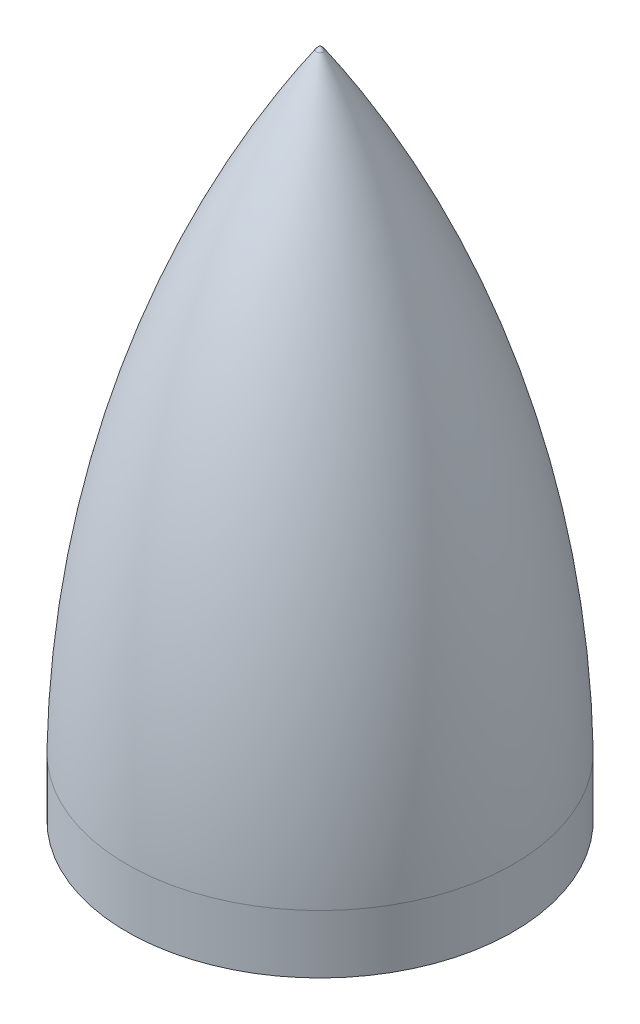
ISO-10303-21;
HEADER;
FILE_DESCRIPTION(('STEP AP214'),'2;1');
FILE_NAME('part.step','',(''),(''),'','','');
FILE_SCHEMA(('AUTOMOTIVE_DESIGN { 1 0 10303 214 1 1 1 1 }'));
ENDSEC;
DATA;
#1=APPLICATION_CONTEXT('core data for automotive mechanical design processes');
#2=APPLICATION_PROTOCOL_DEFINITION('international standard','automotive_design',2000,#1);
#3=PRODUCT_CONTEXT('',#1,'mechanical');
#4=PRODUCT('Part','Part','',(#3));
#5=PRODUCT_RELATED_PRODUCT_CATEGORY('part','',(#4));
#6=PRODUCT_DEFINITION_FORMATION('','',#4);
#7=PRODUCT_DEFINITION_CONTEXT('part definition',#1,'design');
#8=PRODUCT_DEFINITION('design','',#6,#7);
#9=PRODUCT_DEFINITION_SHAPE('','',#8);
#10=(LENGTH_UNIT() NAMED_UNIT(*) SI_UNIT(.MILLI.,.METRE.));
#11=(NAMED_UNIT(*) PLANE_ANGLE_UNIT() SI_UNIT($,.RADIAN.));
#12=(NAMED_UNIT(*) SI_UNIT($,.STERADIAN.) SOLID_ANGLE_UNIT());
#13=UNCERTAINTY_MEASURE_WITH_UNIT(LENGTH_MEASURE(1.E-05),#10,'distance_accuracy_value','');
#14=(GEOMETRIC_REPRESENTATION_CONTEXT(3) GLOBAL_UNCERTAINTY_ASSIGNED_CONTEXT((#13)) GLOBAL_UNIT_ASSIGNED_CONTEXT((#10,
#11,#12)) REPRESENTATION_CONTEXT('',''));
#15=CARTESIAN_POINT('',(0.,0.,0.));
#16=DIRECTION('',(0.,0.,1.));
#17=DIRECTION('',(1.,0.,0.));
#18=AXIS2_PLACEMENT_3D('',#15,#16,#17);
#19=CARTESIAN_POINT('',(0.,4.,0.));
#20=DIRECTION('',(0.,1.,0.));
#21=DIRECTION('',(0.,0.,1.));
#22=AXIS2_PLACEMENT_3D('',#19,#20,#21);
#23=PLANE('',#22);
#24=CARTESIAN_POINT('',(0.,4.,0.));
#25=DIRECTION('',(0.,1.,0.));
#26=DIRECTION('',(0.,0.,1.));
#27=AXIS2_PLACEMENT_3D('',#24,#25,#26);
#28=CIRCLE('',#27,6.00000000000002);
#29=CARTESIAN_POINT('',(0.,4.,6.00000000000002));
#30=VERTEX_POINT('',#29);
#31=EDGE_CURVE('E505',#30,#30,#28,.T.);
#32=ORIENTED_EDGE('',*,*,#31,.F.);
#33=EDGE_LOOP('',(#32));
#34=FACE_BOUND('',#33,.T.);
#35=DIRECTION('',(0.,0.,1.));
#36=VECTOR('',#35,1.);
#37=CARTESIAN_POINT('',(5.00000000000001,4.,0.));
#38=LINE('',#37,#36);
#39=CARTESIAN_POINT('',(5.,4.,6.99999999999998));
#40=VERTEX_POINT('',#39);
#41=CARTESIAN_POINT('',(5.,4.,42.6431706138275));
#42=VERTEX_POINT('',#41);
#43=EDGE_CURVE('E494',#40,#42,#38,.T.);
#44=ORIENTED_EDGE('',*,*,#43,.F.);
#45=CARTESIAN_POINT('',(7.,4.,6.99999999999998));
#46=DIRECTION('',(0.,1.,0.));
#47=DIRECTION('',(0.,0.,1.));
#48=AXIS2_PLACEMENT_3D('',#45,#46,#47);
#49=CIRCLE('',#48,2.);
#50=CARTESIAN_POINT('',(7.00000000000001,4.,4.99999999999998));
#51=VERTEX_POINT('',#50);
#52=EDGE_CURVE('E396',#40,#51,#49,.F.);
#53=ORIENTED_EDGE('',*,*,#52,.T.);
#54=DIRECTION('',(1.,0.,0.));
#55=VECTOR('',#54,1.);
#56=CARTESIAN_POINT('',(0.,4.,4.99999999999998));
#57=LINE('',#56,#55);
#58=CARTESIAN_POINT('',(42.6431706138275,4.,5.));
#59=VERTEX_POINT('',#58);
#60=EDGE_CURVE('E497',#51,#59,#57,.T.);
#61=ORIENTED_EDGE('',*,*,#60,.T.);
#62=CARTESIAN_POINT('',(42.6431706138275,4.,10.));
#63=DIRECTION('',(0.,1.,0.));
#64=DIRECTION('',(0.,0.,1.));
#65=AXIS2_PLACEMENT_3D('',#62,#63,#64);
#66=CIRCLE('',#65,5.);
#67=CARTESIAN_POINT('',(47.511112464721,4.,11.1415525114155));
#68=VERTEX_POINT('',#67);
#69=EDGE_CURVE('E328',#59,#68,#66,.F.);
#70=ORIENTED_EDGE('',*,*,#69,.T.);
#71=CARTESIAN_POINT('',(0.,4.,0.));
#72=DIRECTION('',(0.,-1.,0.));
#73=DIRECTION('',(0.,0.,-1.));
#74=AXIS2_PLACEMENT_3D('',#71,#72,#73);
#75=CIRCLE('',#74,48.8);
#76=CARTESIAN_POINT('',(47.511112464721,4.,-11.1415525114155));
#77=VERTEX_POINT('',#76);
#78=EDGE_CURVE('E239',#77,#68,#75,.T.);
#79=ORIENTED_EDGE('',*,*,#78,.F.);
#80=CARTESIAN_POINT('',(42.6431706138275,4.,-10.));
#81=DIRECTION('',(0.,1.,0.));
#82=DIRECTION('',(0.,0.,1.));
#83=AXIS2_PLACEMENT_3D('',#80,#81,#82);
#84=CIRCLE('',#83,5.);
#85=CARTESIAN_POINT('',(42.6431706138275,4.,-5.));
#86=VERTEX_POINT('',#85);
#87=EDGE_CURVE('E321',#77,#86,#84,.F.);
#88=ORIENTED_EDGE('',*,*,#87,.T.);
#89=DIRECTION('',(1.,0.,0.));
#90=VECTOR('',#89,1.);
#91=CARTESIAN_POINT('',(0.,4.,-5.00000000000002));
#92=LINE('',#91,#90);
#93=CARTESIAN_POINT('',(7.,4.,-5.00000000000002));
#94=VERTEX_POINT('',#93);
#95=EDGE_CURVE('E488',#94,#86,#92,.T.);
#96=ORIENTED_EDGE('',*,*,#95,.F.);
#97=CARTESIAN_POINT('',(7.,4.,-7.00000000000002));
#98=DIRECTION('',(0.,1.,0.));
#99=DIRECTION('',(0.,0.,1.));
#100=AXIS2_PLACEMENT_3D('',#97,#98,#99);
#101=CIRCLE('',#100,2.);
#102=CARTESIAN_POINT('',(5.,4.,-7.00000000000002));
#103=VERTEX_POINT('',#102);
#104=EDGE_CURVE('E390',#94,#103,#101,.F.);
#105=ORIENTED_EDGE('',*,*,#104,.T.);
#106=DIRECTION('',(0.,0.,-1.));
#107=VECTOR('',#106,1.);
#108=CARTESIAN_POINT('',(4.99999999999999,4.,0.));
#109=LINE('',#108,#107);
#110=CARTESIAN_POINT('',(5.00000000000001,4.,-42.6431706138275));
#111=VERTEX_POINT('',#110);
#112=EDGE_CURVE('E491',#103,#111,#109,.T.);
#113=ORIENTED_EDGE('',*,*,#112,.T.);
#114=CARTESIAN_POINT('',(10.,4.,-42.6431706138275));
#115=DIRECTION('',(0.,1.,0.));
#116=DIRECTION('',(0.,0.,1.));
#117=AXIS2_PLACEMENT_3D('',#114,#115,#116);
#118=CIRCLE('',#117,5.);
#119=CARTESIAN_POINT('',(11.1415525114155,4.,-47.511112464721));
#120=VERTEX_POINT('',#119);
#121=EDGE_CURVE('E342',#111,#120,#118,.F.);
#122=ORIENTED_EDGE('',*,*,#121,.T.);
#123=CARTESIAN_POINT('',(-11.1415525114155,4.,-47.511112464721));
#124=VERTEX_POINT('',#123);
#125=EDGE_CURVE('E235',#124,#120,#75,.T.);
#126=ORIENTED_EDGE('',*,*,#125,.F.);
#127=CARTESIAN_POINT('',(-9.99999999999999,4.,-42.6431706138275));
#128=DIRECTION('',(0.,1.,0.));
#129=DIRECTION('',(0.,0.,1.));
#130=AXIS2_PLACEMENT_3D('',#127,#128,#129);
#131=CIRCLE('',#130,5.);
#132=CARTESIAN_POINT('',(-4.99999999999999,4.,-42.6431706138275));
#133=VERTEX_POINT('',#132);
#134=EDGE_CURVE('E335',#124,#133,#131,.F.);
#135=ORIENTED_EDGE('',*,*,#134,.T.);
#136=DIRECTION('',(0.,0.,-1.));
#137=VECTOR('',#136,1.);
#138=CARTESIAN_POINT('',(-5.00000000000001,4.,0.));
#139=LINE('',#138,#137);
#140=CARTESIAN_POINT('',(-5.,4.,-6.99999999999998));
#141=VERTEX_POINT('',#140);
#142=EDGE_CURVE('E483',#141,#133,#139,.T.);
#143=ORIENTED_EDGE('',*,*,#142,.F.);
#144=CARTESIAN_POINT('',(-7.,4.,-6.99999999999998));
#145=DIRECTION('',(0.,1.,0.));
#146=DIRECTION('',(0.,0.,1.));
#147=AXIS2_PLACEMENT_3D('',#144,#145,#146);
#148=CIRCLE('',#147,2.);
#149=CARTESIAN_POINT('',(-7.00000000000001,4.,-4.99999999999998));
#150=VERTEX_POINT('',#149);
#151=EDGE_CURVE('E402',#141,#150,#148,.F.);
#152=ORIENTED_EDGE('',*,*,#151,.T.);
#153=DIRECTION('',(-1.,0.,0.));
#154=VECTOR('',#153,1.);
#155=CARTESIAN_POINT('',(0.,4.,-4.99999999999998));
#156=LINE('',#155,#154);
#157=CARTESIAN_POINT('',(-42.6431706138275,4.,-5.));
#158=VERTEX_POINT('',#157);
#159=EDGE_CURVE('E423',#150,#158,#156,.T.);
#160=ORIENTED_EDGE('',*,*,#159,.T.);
#161=CARTESIAN_POINT('',(-42.6431706138275,4.,-9.99999999999999));
#162=DIRECTION('',(0.,1.,0.));
#163=DIRECTION('',(0.,0.,1.));
#164=AXIS2_PLACEMENT_3D('',#161,#162,#163);
#165=CIRCLE('',#164,5.);
#166=CARTESIAN_POINT('',(-47.511112464721,4.,-11.1415525114155));
#167=VERTEX_POINT('',#166);
#168=EDGE_CURVE('E349',#158,#167,#165,.F.);
#169=ORIENTED_EDGE('',*,*,#168,.T.);
#170=CARTESIAN_POINT('',(-47.511112464721,4.,11.1415525114155));
#171=VERTEX_POINT('',#170);
#172=EDGE_CURVE('E238',#171,#167,#75,.T.);
#173=ORIENTED_EDGE('',*,*,#172,.F.);
#174=CARTESIAN_POINT('',(-42.6431706138275,4.,10.));
#175=DIRECTION('',(0.,1.,0.));
#176=DIRECTION('',(0.,0.,1.));
#177=AXIS2_PLACEMENT_3D('',#174,#175,#176);
#178=CIRCLE('',#177,5.);
#179=CARTESIAN_POINT('',(-42.6431706138275,4.,5.00000000000001));
#180=VERTEX_POINT('',#179);
#181=EDGE_CURVE('E356',#171,#180,#178,.F.);
#182=ORIENTED_EDGE('',*,*,#181,.T.);
#183=DIRECTION('',(-1.,0.,0.));
#184=VECTOR('',#183,1.);
#185=CARTESIAN_POINT('',(0.,4.,5.00000000000002));
#186=LINE('',#185,#184);
#187=CARTESIAN_POINT('',(-6.99999999999999,4.,5.00000000000002));
#188=VERTEX_POINT('',#187);
#189=EDGE_CURVE('E477',#188,#180,#186,.T.);
#190=ORIENTED_EDGE('',*,*,#189,.F.);
#191=CARTESIAN_POINT('',(-6.99999999999999,4.,7.00000000000002));
#192=DIRECTION('',(0.,1.,0.));
#193=DIRECTION('',(0.,0.,1.));
#194=AXIS2_PLACEMENT_3D('',#191,#192,#193);
#195=CIRCLE('',#194,2.);
#196=CARTESIAN_POINT('',(-4.99999999999999,4.,7.00000000000002));
#197=VERTEX_POINT('',#196);
#198=EDGE_CURVE('E11',#188,#197,#195,.F.);
#199=ORIENTED_EDGE('',*,*,#198,.T.);
#200=DIRECTION('',(0.,0.,1.));
#201=VECTOR('',#200,1.);
#202=CARTESIAN_POINT('',(-4.99999999999999,4.,0.));
#203=LINE('',#202,#201);
#204=CARTESIAN_POINT('',(-5.,4.,42.6431706138275));
#205=VERTEX_POINT('',#204);
#206=EDGE_CURVE('E480',#197,#205,#203,.T.);
#207=ORIENTED_EDGE('',*,*,#206,.T.);
#208=CARTESIAN_POINT('',(-10.,4.,42.6431706138275));
#209=DIRECTION('',(0.,1.,0.));
#210=DIRECTION('',(0.,0.,1.));
#211=AXIS2_PLACEMENT_3D('',#208,#209,#210);
#212=CIRCLE('',#211,5.);
#213=CARTESIAN_POINT('',(-11.1415525114155,4.,47.511112464721));
#214=VERTEX_POINT('',#213);
#215=EDGE_CURVE('E314',#205,#214,#212,.F.);
#216=ORIENTED_EDGE('',*,*,#215,.T.);
#217=CARTESIAN_POINT('',(11.1415525114155,4.,47.511112464721));
#218=VERTEX_POINT('',#217);
#219=EDGE_CURVE('E407',#218,#214,#75,.T.);
#220=ORIENTED_EDGE('',*,*,#219,.F.);
#221=CARTESIAN_POINT('',(10.,4.,42.6431706138275));
#222=DIRECTION('',(0.,1.,0.));
#223=DIRECTION('',(0.,0.,1.));
#224=AXIS2_PLACEMENT_3D('',#221,#222,#223);
#225=CIRCLE('',#224,5.);
#226=EDGE_CURVE('E307',#218,#42,#225,.F.);
#227=ORIENTED_EDGE('',*,*,#226,.T.);
#228=EDGE_LOOP('',(#44,#53,#61,#70,#79,#88,#96,#105,#113,#122,#126,#135,#143,#152,#160,#169,
#173,#182,#190,#199,#207,#216,#220,#227));
#229=FACE_BOUND('',#228,.T.);
#230=ADVANCED_FACE('F43',(#34,#229),#23,.T.);
#231=CARTESIAN_POINT('',(0.,0.,0.));
#232=DIRECTION('',(0.,-1.,0.));
#233=DIRECTION('',(0.,0.,-1.));
#234=AXIS2_PLACEMENT_3D('',#231,#232,#233);
#235=CYLINDRICAL_SURFACE('',#234,48.8);
#236=CARTESIAN_POINT('',(0.,0.,0.));
#237=DIRECTION('',(0.,-1.,0.));
#238=DIRECTION('',(0.,0.,-1.));
#239=AXIS2_PLACEMENT_3D('',#236,#237,#238);
#240=CIRCLE('',#239,48.8);
#241=CARTESIAN_POINT('',(47.511112464721,0.,11.1415525114155));
#242=VERTEX_POINT('',#241);
#243=CARTESIAN_POINT('',(11.1415525114155,0.,47.511112464721));
#244=VERTEX_POINT('',#243);
#245=EDGE_CURVE('E463',#242,#244,#240,.T.);
#246=ORIENTED_EDGE('',*,*,#245,.T.);
#247=DIRECTION('',(0.,-1.,0.));
#248=VECTOR('',#247,1.);
#249=CARTESIAN_POINT('',(11.1415525114155,0.,47.511112464721));
#250=LINE('',#249,#248);
#251=EDGE_CURVE('E272',#244,#218,#250,.F.);
#252=ORIENTED_EDGE('',*,*,#251,.T.);
#253=ORIENTED_EDGE('',*,*,#219,.T.);
#254=DIRECTION('',(0.,-1.,0.));
#255=VECTOR('',#254,1.);
#256=CARTESIAN_POINT('',(-11.1415525114155,0.,47.511112464721));
#257=LINE('',#256,#255);
#258=CARTESIAN_POINT('',(-11.1415525114155,0.,47.511112464721));
#259=VERTEX_POINT('',#258);
#260=EDGE_CURVE('E268',#214,#259,#257,.T.);
#261=ORIENTED_EDGE('',*,*,#260,.T.);
#262=CARTESIAN_POINT('',(0.,0.,0.));
#263=DIRECTION('',(0.,-1.,0.));
#264=DIRECTION('',(0.,0.,-1.));
#265=AXIS2_PLACEMENT_3D('',#262,#263,#264);
#266=CIRCLE('',#265,48.8);
#267=CARTESIAN_POINT('',(-47.511112464721,0.,11.1415525114155));
#268=VERTEX_POINT('',#267);
#269=EDGE_CURVE('E471',#259,#268,#266,.T.);
#270=ORIENTED_EDGE('',*,*,#269,.T.);
#271=DIRECTION('',(0.,-1.,0.));
#272=VECTOR('',#271,1.);
#273=CARTESIAN_POINT('',(-47.511112464721,0.,11.1415525114155));
#274=LINE('',#273,#272);
#275=EDGE_CURVE('E244',#268,#171,#274,.F.);
#276=ORIENTED_EDGE('',*,*,#275,.T.);
#277=ORIENTED_EDGE('',*,*,#172,.T.);
#278=DIRECTION('',(0.,-1.,0.));
#279=VECTOR('',#278,1.);
#280=CARTESIAN_POINT('',(-47.511112464721,0.,-11.1415525114155));
#281=LINE('',#280,#279);
#282=CARTESIAN_POINT('',(-47.511112464721,0.,-11.1415525114155));
#283=VERTEX_POINT('',#282);
#284=EDGE_CURVE('E248',#167,#283,#281,.T.);
#285=ORIENTED_EDGE('',*,*,#284,.T.);
#286=CARTESIAN_POINT('',(0.,0.,0.));
#287=DIRECTION('',(0.,-1.,0.));
#288=DIRECTION('',(0.,0.,-1.));
#289=AXIS2_PLACEMENT_3D('',#286,#287,#288);
#290=CIRCLE('',#289,48.8);
#291=CARTESIAN_POINT('',(-11.1415525114155,0.,-47.511112464721));
#292=VERTEX_POINT('',#291);
#293=EDGE_CURVE('E432',#283,#292,#290,.T.);
#294=ORIENTED_EDGE('',*,*,#293,.T.);
#295=DIRECTION('',(0.,-1.,0.));
#296=VECTOR('',#295,1.);
#297=CARTESIAN_POINT('',(-11.1415525114155,0.,-47.511112464721));
#298=LINE('',#297,#296);
#299=EDGE_CURVE('E256',#292,#124,#298,.F.);
#300=ORIENTED_EDGE('',*,*,#299,.T.);
#301=ORIENTED_EDGE('',*,*,#125,.T.);
#302=DIRECTION('',(0.,-1.,0.));
#303=VECTOR('',#302,1.);
#304=CARTESIAN_POINT('',(11.1415525114155,0.,-47.511112464721));
#305=LINE('',#304,#303);
#306=CARTESIAN_POINT('',(11.1415525114155,0.,-47.511112464721));
#307=VERTEX_POINT('',#306);
#308=EDGE_CURVE('E252',#120,#307,#305,.T.);
#309=ORIENTED_EDGE('',*,*,#308,.T.);
#310=CARTESIAN_POINT('',(0.,0.,0.));
#311=DIRECTION('',(0.,-1.,0.));
#312=DIRECTION('',(0.,0.,-1.));
#313=AXIS2_PLACEMENT_3D('',#310,#311,#312);
#314=CIRCLE('',#313,48.8);
#315=CARTESIAN_POINT('',(47.511112464721,0.,-11.1415525114155));
#316=VERTEX_POINT('',#315);
#317=EDGE_CURVE('E444',#307,#316,#314,.T.);
#318=ORIENTED_EDGE('',*,*,#317,.T.);
#319=DIRECTION('',(0.,-1.,0.));
#320=VECTOR('',#319,1.);
#321=CARTESIAN_POINT('',(47.511112464721,0.,-11.1415525114155));
#322=LINE('',#321,#320);
#323=EDGE_CURVE('E264',#316,#77,#322,.F.);
#324=ORIENTED_EDGE('',*,*,#323,.T.);
#325=ORIENTED_EDGE('',*,*,#78,.T.);
#326=DIRECTION('',(0.,-1.,0.));
#327=VECTOR('',#326,1.);
#328=CARTESIAN_POINT('',(47.511112464721,0.,11.1415525114155));
#329=LINE('',#328,#327);
#330=EDGE_CURVE('E260',#68,#242,#329,.T.);
#331=ORIENTED_EDGE('',*,*,#330,.T.);
#332=EDGE_LOOP('',(#246,#252,#253,#261,#270,#276,#277,#285,#294,#300,#301,#309,#318,#324,#325,#331));
#333=FACE_BOUND('',#332,.T.);
#334=CARTESIAN_POINT('',(0.,14.9936554390348,0.));
#335=DIRECTION('',(0.,-1.,0.));
#336=DIRECTION('',(0.,0.,-1.));
#337=AXIS2_PLACEMENT_3D('',#334,#335,#336);
#338=CIRCLE('',#337,48.8);
#339=CARTESIAN_POINT('',(0.,14.9936554390348,-48.8));
#340=VERTEX_POINT('',#339);
#341=EDGE_CURVE('E225',#340,#340,#338,.T.);
#342=ORIENTED_EDGE('',*,*,#341,.F.);
#343=EDGE_LOOP('',(#342));
#344=FACE_BOUND('',#343,.T.);
#345=ADVANCED_FACE('F411',(#333,#344),#235,.F.);
#346=CARTESIAN_POINT('',(0.,10.4036566615262,0.));
#347=DIRECTION('',(0.,-1.,0.));
#348=DIRECTION('',(0.,0.,-1.));
#349=AXIS2_PLACEMENT_3D('',#346,#347,#348);
#350=DEGENERATE_TOROIDAL_SURFACE('',#349,240.36357293273,289.2,.F.);
#351=ORIENTED_EDGE('',*,*,#341,.T.);
#352=EDGE_LOOP('',(#351));
#353=FACE_BOUND('',#352,.T.);
#354=CARTESIAN_POINT('',(0.,170.875634073948,0.));
#355=DIRECTION('',(0.,-1.,0.));
#356=DIRECTION('',(0.,0.,-1.));
#357=AXIS2_PLACEMENT_3D('',#354,#355,#356);
#358=CIRCLE('',#357,0.230243416209184);
#359=CARTESIAN_POINT('',(0.,170.875634073948,-0.230243416209184));
#360=VERTEX_POINT('',#359);
#361=EDGE_CURVE('E219',#360,#360,#358,.T.);
#362=ORIENTED_EDGE('',*,*,#361,.F.);
#363=EDGE_LOOP('',(#362));
#364=FACE_BOUND('',#363,.T.);
#365=ADVANCED_FACE('F540',(#353,#364),#350,.T.);
#366=CARTESIAN_POINT('',(0.,169.654892890313,1.59999999999992));
#367=DIRECTION('',(-1.,0.,0.));
#368=DIRECTION('',(0.,0.,-1.));
#369=AXIS2_PLACEMENT_3D('',#366,#367,#368);
#370=CIRCLE('',#369,2.20000000000002);
#371=TRIMMED_CURVE('',#370,(PARAMETER_VALUE(-0.756456384668434)),
(PARAMETER_VALUE(0.756456384668434)),.T.,.PARAMETER.);
#372=CARTESIAN_POINT('',(0.,169.654892890313,0.));
#373=DIRECTION('',(0.,-1.,0.));
#374=AXIS1_PLACEMENT('',#372,#373);
#375=SURFACE_OF_REVOLUTION('',#371,#374);
#376=ORIENTED_EDGE('',*,*,#361,.T.);
#377=EDGE_LOOP('',(#376));
#378=FACE_BOUND('',#377,.T.);
#379=CARTESIAN_POINT('',(0.,171.164859777367,0.));
#380=VERTEX_POINT('',#379);
#381=VERTEX_LOOP('',#380);
#382=FACE_BOUND('',#381,.T.);
#383=ADVANCED_FACE('F666',(#378,#382),#375,.F.);
#384=CARTESIAN_POINT('',(0.,74.,0.));
#385=DIRECTION('',(0.,-1.,0.));
#386=DIRECTION('',(0.,0.,-1.));
#387=AXIS2_PLACEMENT_3D('',#384,#385,#386);
#388=PLANE('',#387);
#389=CARTESIAN_POINT('',(0.,74.,0.));
#390=DIRECTION('',(0.,1.,0.));
#391=DIRECTION('',(0.,0.,1.));
#392=AXIS2_PLACEMENT_3D('',#389,#390,#391);
#393=CIRCLE('',#392,6.00000000000001);
#394=CARTESIAN_POINT('',(0.,74.,6.00000000000001));
#395=VERTEX_POINT('',#394);
#396=EDGE_CURVE('E512',#395,#395,#393,.T.);
#397=ORIENTED_EDGE('',*,*,#396,.T.);
#398=EDGE_LOOP('',(#397));
#399=FACE_BOUND('',#398,.T.);
#400=ADVANCED_FACE('F663',(#399),#388,.F.);
#401=CARTESIAN_POINT('',(0.,170.875634073948,0.));
#402=DIRECTION('',(0.,1.,0.));
#403=DIRECTION('',(0.,0.,1.));
#404=AXIS2_PLACEMENT_3D('',#401,#402,#403);
#405=CYLINDRICAL_SURFACE('',#404,6.00000000000002);
#406=ORIENTED_EDGE('',*,*,#396,.F.);
#407=EDGE_LOOP('',(#406));
#408=FACE_BOUND('',#407,.T.);
#409=ORIENTED_EDGE('',*,*,#31,.T.);
#410=EDGE_LOOP('',(#409));
#411=FACE_BOUND('',#410,.T.);
#412=ADVANCED_FACE('F653',(#408,#411),#405,.T.);
#413=CARTESIAN_POINT('',(-4.99999999999999,10.,0.));
#414=DIRECTION('',(-1.,0.,0.));
#415=DIRECTION('',(0.,0.,1.));
#416=AXIS2_PLACEMENT_3D('',#413,#414,#415);
#417=PLANE('',#416);
#418=ORIENTED_EDGE('',*,*,#206,.F.);
#419=DIRECTION('',(0.,-1.,0.));
#420=VECTOR('',#419,1.);
#421=CARTESIAN_POINT('',(-4.99999999999999,10.,7.00000000000002));
#422=LINE('',#421,#420);
#423=CARTESIAN_POINT('',(-4.99999999999999,0.,7.00000000000002));
#424=VERTEX_POINT('',#423);
#425=EDGE_CURVE('E381',#197,#424,#422,.T.);
#426=ORIENTED_EDGE('',*,*,#425,.T.);
#427=DIRECTION('',(0.,0.,-1.));
#428=VECTOR('',#427,1.);
#429=CARTESIAN_POINT('',(-4.99999999999999,0.,0.));
#430=LINE('',#429,#428);
#431=CARTESIAN_POINT('',(-5.,0.,42.6431706138275));
#432=VERTEX_POINT('',#431);
#433=EDGE_CURVE('E450',#432,#424,#430,.T.);
#434=ORIENTED_EDGE('',*,*,#433,.F.);
#435=DIRECTION('',(0.,1.,0.));
#436=VECTOR('',#435,1.);
#437=CARTESIAN_POINT('',(-5.,4.,42.6431706138275));
#438=LINE('',#437,#436);
#439=EDGE_CURVE('E276',#432,#205,#438,.T.);
#440=ORIENTED_EDGE('',*,*,#439,.T.);
#441=EDGE_LOOP('',(#418,#426,#434,#440));
#442=FACE_BOUND('',#441,.T.);
#443=ADVANCED_FACE('F641',(#442),#417,.T.);
#444=CARTESIAN_POINT('',(0.,10.,5.00000000000002));
#445=DIRECTION('',(0.,0.,-1.));
#446=DIRECTION('',(-1.,0.,0.));
#447=AXIS2_PLACEMENT_3D('',#444,#445,#446);
#448=PLANE('',#447);
#449=DIRECTION('',(1.,0.,0.));
#450=VECTOR('',#449,1.);
#451=CARTESIAN_POINT('',(0.,0.,5.00000000000002));
#452=LINE('',#451,#450);
#453=CARTESIAN_POINT('',(-42.6431706138275,0.,5.00000000000001));
#454=VERTEX_POINT('',#453);
#455=CARTESIAN_POINT('',(-6.99999999999999,0.,5.00000000000002));
#456=VERTEX_POINT('',#455);
#457=EDGE_CURVE('E474',#454,#456,#452,.T.);
#458=ORIENTED_EDGE('',*,*,#457,.T.);
#459=DIRECTION('',(0.,-1.,0.));
#460=VECTOR('',#459,1.);
#461=CARTESIAN_POINT('',(-6.99999999999999,10.,5.00000000000002));
#462=LINE('',#461,#460);
#463=EDGE_CURVE('E65',#456,#188,#462,.F.);
#464=ORIENTED_EDGE('',*,*,#463,.T.);
#465=ORIENTED_EDGE('',*,*,#189,.T.);
#466=DIRECTION('',(0.,-1.,0.));
#467=VECTOR('',#466,1.);
#468=CARTESIAN_POINT('',(-42.6431706138275,10.,5.00000000000001));
#469=LINE('',#468,#467);
#470=EDGE_CURVE('E300',#180,#454,#469,.T.);
#471=ORIENTED_EDGE('',*,*,#470,.T.);
#472=EDGE_LOOP('',(#458,#464,#465,#471));
#473=FACE_BOUND('',#472,.T.);
#474=ADVANCED_FACE('F645',(#473),#448,.F.);
#475=CARTESIAN_POINT('',(0.,10.,-4.99999999999998));
#476=DIRECTION('',(0.,0.,-1.));
#477=DIRECTION('',(-1.,0.,0.));
#478=AXIS2_PLACEMENT_3D('',#475,#476,#477);
#479=PLANE('',#478);
#480=ORIENTED_EDGE('',*,*,#159,.F.);
#481=DIRECTION('',(0.,-1.,0.));
#482=VECTOR('',#481,1.);
#483=CARTESIAN_POINT('',(-7.00000000000001,10.,-4.99999999999998));
#484=LINE('',#483,#482);
#485=CARTESIAN_POINT('',(-7.00000000000001,0.,-4.99999999999998));
#486=VERTEX_POINT('',#485);
#487=EDGE_CURVE('E374',#150,#486,#484,.T.);
#488=ORIENTED_EDGE('',*,*,#487,.T.);
#489=DIRECTION('',(1.,0.,0.));
#490=VECTOR('',#489,1.);
#491=CARTESIAN_POINT('',(0.,0.,-4.99999999999998));
#492=LINE('',#491,#490);
#493=CARTESIAN_POINT('',(-42.6431706138275,0.,-5.));
#494=VERTEX_POINT('',#493);
#495=EDGE_CURVE('E431',#494,#486,#492,.T.);
#496=ORIENTED_EDGE('',*,*,#495,.F.);
#497=DIRECTION('',(0.,1.,0.));
#498=VECTOR('',#497,1.);
#499=CARTESIAN_POINT('',(-42.6431706138275,4.,-5.));
#500=LINE('',#499,#498);
#501=EDGE_CURVE('E296',#494,#158,#500,.T.);
#502=ORIENTED_EDGE('',*,*,#501,.T.);
#503=EDGE_LOOP('',(#480,#488,#496,#502));
#504=FACE_BOUND('',#503,.T.);
#505=ADVANCED_FACE('F434',(#504),#479,.T.);
#506=CARTESIAN_POINT('',(-5.00000000000001,10.,0.));
#507=DIRECTION('',(1.,0.,0.));
#508=DIRECTION('',(0.,0.,-1.));
#509=AXIS2_PLACEMENT_3D('',#506,#507,#508);
#510=PLANE('',#509);
#511=DIRECTION('',(0.,0.,1.));
#512=VECTOR('',#511,1.);
#513=CARTESIAN_POINT('',(-5.00000000000001,0.,0.));
#514=LINE('',#513,#512);
#515=CARTESIAN_POINT('',(-4.99999999999999,0.,-42.6431706138275));
#516=VERTEX_POINT('',#515);
#517=CARTESIAN_POINT('',(-5.,0.,-6.99999999999998));
#518=VERTEX_POINT('',#517);
#519=EDGE_CURVE('E441',#516,#518,#514,.T.);
#520=ORIENTED_EDGE('',*,*,#519,.T.);
#521=DIRECTION('',(0.,-1.,0.));
#522=VECTOR('',#521,1.);
#523=CARTESIAN_POINT('',(-5.,10.,-6.99999999999998));
#524=LINE('',#523,#522);
#525=EDGE_CURVE('E378',#518,#141,#524,.F.);
#526=ORIENTED_EDGE('',*,*,#525,.T.);
#527=ORIENTED_EDGE('',*,*,#142,.T.);
#528=DIRECTION('',(0.,-1.,0.));
#529=VECTOR('',#528,1.);
#530=CARTESIAN_POINT('',(-4.99999999999999,10.,-42.6431706138275));
#531=LINE('',#530,#529);
#532=EDGE_CURVE('E288',#133,#516,#531,.T.);
#533=ORIENTED_EDGE('',*,*,#532,.T.);
#534=EDGE_LOOP('',(#520,#526,#527,#533));
#535=FACE_BOUND('',#534,.T.);
#536=ADVANCED_FACE('F595',(#535),#510,.F.);
#537=CARTESIAN_POINT('',(4.99999999999999,10.,0.));
#538=DIRECTION('',(1.,0.,0.));
#539=DIRECTION('',(0.,0.,-1.));
#540=AXIS2_PLACEMENT_3D('',#537,#538,#539);
#541=PLANE('',#540);
#542=ORIENTED_EDGE('',*,*,#112,.F.);
#543=DIRECTION('',(0.,-1.,0.));
#544=VECTOR('',#543,1.);
#545=CARTESIAN_POINT('',(5.,10.,-7.00000000000002));
#546=LINE('',#545,#544);
#547=CARTESIAN_POINT('',(5.,0.,-7.00000000000002));
#548=VERTEX_POINT('',#547);
#549=EDGE_CURVE('E360',#103,#548,#546,.T.);
#550=ORIENTED_EDGE('',*,*,#549,.T.);
#551=DIRECTION('',(0.,0.,1.));
#552=VECTOR('',#551,1.);
#553=CARTESIAN_POINT('',(4.99999999999999,0.,0.));
#554=LINE('',#553,#552);
#555=CARTESIAN_POINT('',(5.00000000000001,0.,-42.6431706138275));
#556=VERTEX_POINT('',#555);
#557=EDGE_CURVE('E451',#556,#548,#554,.T.);
#558=ORIENTED_EDGE('',*,*,#557,.F.);
#559=DIRECTION('',(0.,1.,0.));
#560=VECTOR('',#559,1.);
#561=CARTESIAN_POINT('',(5.00000000000001,4.,-42.6431706138275));
#562=LINE('',#561,#560);
#563=EDGE_CURVE('E292',#556,#111,#562,.T.);
#564=ORIENTED_EDGE('',*,*,#563,.T.);
#565=EDGE_LOOP('',(#542,#550,#558,#564));
#566=FACE_BOUND('',#565,.T.);
#567=ADVANCED_FACE('F606',(#566),#541,.T.);
#568=CARTESIAN_POINT('',(0.,10.,-5.00000000000002));
#569=DIRECTION('',(0.,0.,1.));
#570=DIRECTION('',(1.,0.,0.));
#571=AXIS2_PLACEMENT_3D('',#568,#569,#570);
#572=PLANE('',#571);
#573=DIRECTION('',(-1.,0.,0.));
#574=VECTOR('',#573,1.);
#575=CARTESIAN_POINT('',(0.,0.,-5.00000000000002));
#576=LINE('',#575,#574);
#577=CARTESIAN_POINT('',(42.6431706138275,0.,-5.));
#578=VERTEX_POINT('',#577);
#579=CARTESIAN_POINT('',(7.,0.,-5.00000000000002));
#580=VERTEX_POINT('',#579);
#581=EDGE_CURVE('E437',#578,#580,#576,.T.);
#582=ORIENTED_EDGE('',*,*,#581,.T.);
#583=DIRECTION('',(0.,-1.,0.));
#584=VECTOR('',#583,1.);
#585=CARTESIAN_POINT('',(7.,10.,-5.00000000000002));
#586=LINE('',#585,#584);
#587=EDGE_CURVE('E364',#580,#94,#586,.F.);
#588=ORIENTED_EDGE('',*,*,#587,.T.);
#589=ORIENTED_EDGE('',*,*,#95,.T.);
#590=DIRECTION('',(0.,-1.,0.));
#591=VECTOR('',#590,1.);
#592=CARTESIAN_POINT('',(42.6431706138275,10.,-5.));
#593=LINE('',#592,#591);
#594=EDGE_CURVE('E280',#86,#578,#593,.T.);
#595=ORIENTED_EDGE('',*,*,#594,.T.);
#596=EDGE_LOOP('',(#582,#588,#589,#595));
#597=FACE_BOUND('',#596,.T.);
#598=ADVANCED_FACE('F612',(#597),#572,.F.);
#599=CARTESIAN_POINT('',(0.,10.,4.99999999999998));
#600=DIRECTION('',(0.,0.,1.));
#601=DIRECTION('',(1.,0.,0.));
#602=AXIS2_PLACEMENT_3D('',#599,#600,#601);
#603=PLANE('',#602);
#604=ORIENTED_EDGE('',*,*,#60,.F.);
#605=DIRECTION('',(0.,-1.,0.));
#606=VECTOR('',#605,1.);
#607=CARTESIAN_POINT('',(7.00000000000001,10.,4.99999999999998));
#608=LINE('',#607,#606);
#609=CARTESIAN_POINT('',(7.00000000000001,0.,4.99999999999998));
#610=VERTEX_POINT('',#609);
#611=EDGE_CURVE('E367',#51,#610,#608,.T.);
#612=ORIENTED_EDGE('',*,*,#611,.T.);
#613=DIRECTION('',(-1.,0.,0.));
#614=VECTOR('',#613,1.);
#615=CARTESIAN_POINT('',(0.,0.,4.99999999999998));
#616=LINE('',#615,#614);
#617=CARTESIAN_POINT('',(42.6431706138275,0.,5.));
#618=VERTEX_POINT('',#617);
#619=EDGE_CURVE('E459',#618,#610,#616,.T.);
#620=ORIENTED_EDGE('',*,*,#619,.F.);
#621=DIRECTION('',(0.,1.,0.));
#622=VECTOR('',#621,1.);
#623=CARTESIAN_POINT('',(42.6431706138275,4.,5.));
#624=LINE('',#623,#622);
#625=EDGE_CURVE('E284',#618,#59,#624,.T.);
#626=ORIENTED_EDGE('',*,*,#625,.T.);
#627=EDGE_LOOP('',(#604,#612,#620,#626));
#628=FACE_BOUND('',#627,.T.);
#629=ADVANCED_FACE('F624',(#628),#603,.T.);
#630=CARTESIAN_POINT('',(5.00000000000001,10.,0.));
#631=DIRECTION('',(-1.,0.,0.));
#632=DIRECTION('',(0.,0.,1.));
#633=AXIS2_PLACEMENT_3D('',#630,#631,#632);
#634=PLANE('',#633);
#635=DIRECTION('',(0.,0.,-1.));
#636=VECTOR('',#635,1.);
#637=CARTESIAN_POINT('',(5.00000000000001,0.,0.));
#638=LINE('',#637,#636);
#639=CARTESIAN_POINT('',(5.,0.,42.6431706138275));
#640=VERTEX_POINT('',#639);
#641=CARTESIAN_POINT('',(5.,0.,6.99999999999998));
#642=VERTEX_POINT('',#641);
#643=EDGE_CURVE('E455',#640,#642,#638,.T.);
#644=ORIENTED_EDGE('',*,*,#643,.T.);
#645=DIRECTION('',(0.,-1.,0.));
#646=VECTOR('',#645,1.);
#647=CARTESIAN_POINT('',(5.,10.,6.99999999999998));
#648=LINE('',#647,#646);
#649=EDGE_CURVE('E371',#642,#40,#648,.F.);
#650=ORIENTED_EDGE('',*,*,#649,.T.);
#651=ORIENTED_EDGE('',*,*,#43,.T.);
#652=DIRECTION('',(0.,-1.,0.));
#653=VECTOR('',#652,1.);
#654=CARTESIAN_POINT('',(5.,10.,42.6431706138275));
#655=LINE('',#654,#653);
#656=EDGE_CURVE('E240',#42,#640,#655,.T.);
#657=ORIENTED_EDGE('',*,*,#656,.T.);
#658=EDGE_LOOP('',(#644,#650,#651,#657));
#659=FACE_BOUND('',#658,.T.);
#660=ADVANCED_FACE('F630',(#659),#634,.F.);
#661=CARTESIAN_POINT('',(0.,0.,0.));
#662=DIRECTION('',(0.,-1.,0.));
#663=DIRECTION('',(0.,0.,-1.));
#664=AXIS2_PLACEMENT_3D('',#661,#662,#663);
#665=PLANE('',#664);
#666=CARTESIAN_POINT('',(0.,0.,0.));
#667=DIRECTION('',(0.,-1.,0.));
#668=DIRECTION('',(0.,0.,-1.));
#669=AXIS2_PLACEMENT_3D('',#666,#667,#668);
#670=CIRCLE('',#669,4.4);
#671=CARTESIAN_POINT('',(0.,0.,-4.4));
#672=VERTEX_POINT('',#671);
#673=EDGE_CURVE('E500',#672,#672,#670,.T.);
#674=ORIENTED_EDGE('',*,*,#673,.F.);
#675=EDGE_LOOP('',(#674));
#676=FACE_BOUND('',#675,.T.);
#677=CARTESIAN_POINT('',(0.,0.,0.));
#678=DIRECTION('',(0.,-1.,0.));
#679=DIRECTION('',(0.,0.,-1.));
#680=AXIS2_PLACEMENT_3D('',#677,#678,#679);
#681=CIRCLE('',#680,49.6);
#682=CARTESIAN_POINT('',(0.,0.,-49.6));
#683=VERTEX_POINT('',#682);
#684=EDGE_CURVE('E228',#683,#683,#681,.T.);
#685=ORIENTED_EDGE('',*,*,#684,.T.);
#686=EDGE_LOOP('',(#685));
#687=FACE_BOUND('',#686,.T.);
#688=ORIENTED_EDGE('',*,*,#269,.F.);
#689=CARTESIAN_POINT('',(-10.,0.,42.6431706138275));
#690=DIRECTION('',(0.,-1.,0.));
#691=DIRECTION('',(0.,0.,-1.));
#692=AXIS2_PLACEMENT_3D('',#689,#690,#691);
#693=CIRCLE('',#692,5.);
#694=EDGE_CURVE('E311',#259,#432,#693,.F.);
#695=ORIENTED_EDGE('',*,*,#694,.T.);
#696=ORIENTED_EDGE('',*,*,#433,.T.);
#697=CARTESIAN_POINT('',(-6.99999999999999,0.,7.00000000000002));
#698=DIRECTION('',(0.,-1.,0.));
#699=DIRECTION('',(0.,0.,-1.));
#700=AXIS2_PLACEMENT_3D('',#697,#698,#699);
#701=CIRCLE('',#700,2.);
#702=EDGE_CURVE('E52',#424,#456,#701,.F.);
#703=ORIENTED_EDGE('',*,*,#702,.T.);
#704=ORIENTED_EDGE('',*,*,#457,.F.);
#705=CARTESIAN_POINT('',(-42.6431706138275,0.,10.));
#706=DIRECTION('',(0.,-1.,0.));
#707=DIRECTION('',(0.,0.,-1.));
#708=AXIS2_PLACEMENT_3D('',#705,#706,#707);
#709=CIRCLE('',#708,5.);
#710=EDGE_CURVE('E353',#454,#268,#709,.F.);
#711=ORIENTED_EDGE('',*,*,#710,.T.);
#712=EDGE_LOOP('',(#688,#695,#696,#703,#704,#711));
#713=FACE_BOUND('',#712,.T.);
#714=ORIENTED_EDGE('',*,*,#293,.F.);
#715=CARTESIAN_POINT('',(-42.6431706138275,0.,-9.99999999999999));
#716=DIRECTION('',(0.,-1.,0.));
#717=DIRECTION('',(0.,0.,-1.));
#718=AXIS2_PLACEMENT_3D('',#715,#716,#717);
#719=CIRCLE('',#718,5.);
#720=EDGE_CURVE('E346',#283,#494,#719,.F.);
#721=ORIENTED_EDGE('',*,*,#720,.T.);
#722=ORIENTED_EDGE('',*,*,#495,.T.);
#723=CARTESIAN_POINT('',(-7.,0.,-6.99999999999998));
#724=DIRECTION('',(0.,-1.,0.));
#725=DIRECTION('',(0.,0.,-1.));
#726=AXIS2_PLACEMENT_3D('',#723,#724,#725);
#727=CIRCLE('',#726,2.);
#728=EDGE_CURVE('E399',#486,#518,#727,.F.);
#729=ORIENTED_EDGE('',*,*,#728,.T.);
#730=ORIENTED_EDGE('',*,*,#519,.F.);
#731=CARTESIAN_POINT('',(-9.99999999999999,0.,-42.6431706138275));
#732=DIRECTION('',(0.,-1.,0.));
#733=DIRECTION('',(0.,0.,-1.));
#734=AXIS2_PLACEMENT_3D('',#731,#732,#733);
#735=CIRCLE('',#734,5.);
#736=EDGE_CURVE('E332',#516,#292,#735,.F.);
#737=ORIENTED_EDGE('',*,*,#736,.T.);
#738=EDGE_LOOP('',(#714,#721,#722,#729,#730,#737));
#739=FACE_BOUND('',#738,.T.);
#740=ORIENTED_EDGE('',*,*,#317,.F.);
#741=CARTESIAN_POINT('',(10.,0.,-42.6431706138275));
#742=DIRECTION('',(0.,-1.,0.));
#743=DIRECTION('',(0.,0.,-1.));
#744=AXIS2_PLACEMENT_3D('',#741,#742,#743);
#745=CIRCLE('',#744,5.);
#746=EDGE_CURVE('E339',#307,#556,#745,.F.);
#747=ORIENTED_EDGE('',*,*,#746,.T.);
#748=ORIENTED_EDGE('',*,*,#557,.T.);
#749=CARTESIAN_POINT('',(7.,0.,-7.00000000000002));
#750=DIRECTION('',(0.,-1.,0.));
#751=DIRECTION('',(0.,0.,-1.));
#752=AXIS2_PLACEMENT_3D('',#749,#750,#751);
#753=CIRCLE('',#752,2.);
#754=EDGE_CURVE('E387',#548,#580,#753,.F.);
#755=ORIENTED_EDGE('',*,*,#754,.T.);
#756=ORIENTED_EDGE('',*,*,#581,.F.);
#757=CARTESIAN_POINT('',(42.6431706138275,0.,-10.));
#758=DIRECTION('',(0.,-1.,0.));
#759=DIRECTION('',(0.,0.,-1.));
#760=AXIS2_PLACEMENT_3D('',#757,#758,#759);
#761=CIRCLE('',#760,5.);
#762=EDGE_CURVE('E318',#578,#316,#761,.F.);
#763=ORIENTED_EDGE('',*,*,#762,.T.);
#764=EDGE_LOOP('',(#740,#747,#748,#755,#756,#763));
#765=FACE_BOUND('',#764,.T.);
#766=ORIENTED_EDGE('',*,*,#245,.F.);
#767=CARTESIAN_POINT('',(42.6431706138275,0.,10.));
#768=DIRECTION('',(0.,-1.,0.));
#769=DIRECTION('',(0.,0.,-1.));
#770=AXIS2_PLACEMENT_3D('',#767,#768,#769);
#771=CIRCLE('',#770,5.);
#772=EDGE_CURVE('E325',#242,#618,#771,.F.);
#773=ORIENTED_EDGE('',*,*,#772,.T.);
#774=ORIENTED_EDGE('',*,*,#619,.T.);
#775=CARTESIAN_POINT('',(7.,0.,6.99999999999998));
#776=DIRECTION('',(0.,-1.,0.));
#777=DIRECTION('',(0.,0.,-1.));
#778=AXIS2_PLACEMENT_3D('',#775,#776,#777);
#779=CIRCLE('',#778,2.);
#780=EDGE_CURVE('E393',#610,#642,#779,.F.);
#781=ORIENTED_EDGE('',*,*,#780,.T.);
#782=ORIENTED_EDGE('',*,*,#643,.F.);
#783=CARTESIAN_POINT('',(10.,0.,42.6431706138275));
#784=DIRECTION('',(0.,-1.,0.));
#785=DIRECTION('',(0.,0.,-1.));
#786=AXIS2_PLACEMENT_3D('',#783,#784,#785);
#787=CIRCLE('',#786,5.);
#788=EDGE_CURVE('E304',#640,#244,#787,.F.);
#789=ORIENTED_EDGE('',*,*,#788,.T.);
#790=EDGE_LOOP('',(#766,#773,#774,#781,#782,#789));
#791=FACE_BOUND('',#790,.T.);
#792=ADVANCED_FACE('F212',(#676,#687,#713,#739,#765,#791),#665,.T.);
#793=CARTESIAN_POINT('',(0.,169.654892890313,1.59999999999992));
#794=DIRECTION('',(-1.,0.,0.));
#795=DIRECTION('',(0.,0.,-1.));
#796=AXIS2_PLACEMENT_3D('',#793,#794,#795);
#797=CIRCLE('',#796,3.00000000000002);
#798=TRIMMED_CURVE('',#797,(PARAMETER_VALUE(-1.00826008225108)),
(PARAMETER_VALUE(1.00826008225108)),.T.,.PARAMETER.);
#799=CARTESIAN_POINT('',(0.,169.654892890313,0.));
#800=DIRECTION('',(0.,-1.,0.));
#801=AXIS1_PLACEMENT('',#799,#800);
#802=SURFACE_OF_REVOLUTION('',#798,#801);
#803=CARTESIAN_POINT('',(0.,172.192608398403,0.));
#804=VERTEX_POINT('',#803);
#805=VERTEX_LOOP('',#804);
#806=FACE_BOUND('',#805,.T.);
#807=CARTESIAN_POINT('',(0.,171.319539958906,0.));
#808=DIRECTION('',(0.,-1.,0.));
#809=DIRECTION('',(0.,0.,-1.));
#810=AXIS2_PLACEMENT_3D('',#807,#808,#809);
#811=CIRCLE('',#810,0.895786476648841);
#812=CARTESIAN_POINT('',(0.,171.319539958906,-0.895786476648841));
#813=VERTEX_POINT('',#812);
#814=EDGE_CURVE('E216',#813,#813,#811,.T.);
#815=ORIENTED_EDGE('',*,*,#814,.F.);
#816=EDGE_LOOP('',(#815));
#817=FACE_BOUND('',#816,.T.);
#818=ADVANCED_FACE('F208',(#806,#817),#802,.T.);
#819=CARTESIAN_POINT('',(0.,10.4036566615262,0.));
#820=DIRECTION('',(0.,-1.,0.));
#821=DIRECTION('',(0.,0.,-1.));
#822=AXIS2_PLACEMENT_3D('',#819,#820,#821);
#823=DEGENERATE_TOROIDAL_SURFACE('',#822,240.36357293273,290.,.F.);
#824=ORIENTED_EDGE('',*,*,#814,.T.);
#825=EDGE_LOOP('',(#824));
#826=FACE_BOUND('',#825,.T.);
#827=CARTESIAN_POINT('',(0.,15.,0.));
#828=DIRECTION('',(0.,-1.,0.));
#829=DIRECTION('',(0.,0.,-1.));
#830=AXIS2_PLACEMENT_3D('',#827,#828,#829);
#831=CIRCLE('',#830,49.6);
#832=CARTESIAN_POINT('',(0.,15.,-49.6));
#833=VERTEX_POINT('',#832);
#834=EDGE_CURVE('E220',#833,#833,#831,.T.);
#835=ORIENTED_EDGE('',*,*,#834,.F.);
#836=EDGE_LOOP('',(#835));
#837=FACE_BOUND('',#836,.T.);
#838=ADVANCED_FACE('F211',(#826,#837),#823,.F.);
#839=CARTESIAN_POINT('',(0.,0.,0.));
#840=DIRECTION('',(0.,-1.,0.));
#841=DIRECTION('',(0.,0.,-1.));
#842=AXIS2_PLACEMENT_3D('',#839,#840,#841);
#843=CYLINDRICAL_SURFACE('',#842,49.6);
#844=ORIENTED_EDGE('',*,*,#834,.T.);
#845=EDGE_LOOP('',(#844));
#846=FACE_BOUND('',#845,.T.);
#847=ORIENTED_EDGE('',*,*,#684,.F.);
#848=EDGE_LOOP('',(#847));
#849=FACE_BOUND('',#848,.T.);
#850=ADVANCED_FACE('F520',(#846,#849),#843,.T.);
#851=CARTESIAN_POINT('',(0.,70.,0.));
#852=DIRECTION('',(0.,-1.,0.));
#853=DIRECTION('',(0.,0.,-1.));
#854=AXIS2_PLACEMENT_3D('',#851,#852,#853);
#855=CYLINDRICAL_SURFACE('',#854,4.4);
#856=CARTESIAN_POINT('',(0.,70.,0.));
#857=DIRECTION('',(0.,-1.,0.));
#858=DIRECTION('',(0.,0.,-1.));
#859=AXIS2_PLACEMENT_3D('',#856,#857,#858);
#860=CIRCLE('',#859,4.4);
#861=CARTESIAN_POINT('',(0.,70.,-4.4));
#862=VERTEX_POINT('',#861);
#863=EDGE_CURVE('E501',#862,#862,#860,.T.);
#864=ORIENTED_EDGE('',*,*,#863,.F.);
#865=EDGE_LOOP('',(#864));
#866=FACE_BOUND('',#865,.T.);
#867=ORIENTED_EDGE('',*,*,#673,.T.);
#868=EDGE_LOOP('',(#867));
#869=FACE_BOUND('',#868,.T.);
#870=ADVANCED_FACE('F522',(#866,#869),#855,.F.);
#871=CARTESIAN_POINT('',(0.,70.,0.));
#872=DIRECTION('',(0.,-1.,0.));
#873=DIRECTION('',(0.,0.,-1.));
#874=AXIS2_PLACEMENT_3D('',#871,#872,#873);
#875=PLANE('',#874);
#876=ORIENTED_EDGE('',*,*,#863,.T.);
#877=EDGE_LOOP('',(#876));
#878=FACE_BOUND('',#877,.T.);
#879=ADVANCED_FACE('F529',(#878),#875,.T.);
#880=CARTESIAN_POINT('',(10.,0.,42.6431706138275));
#881=DIRECTION('',(0.,-1.,0.));
#882=DIRECTION('',(0.,0.,-1.));
#883=AXIS2_PLACEMENT_3D('',#880,#881,#882);
#884=CYLINDRICAL_SURFACE('',#883,5.);
#885=ORIENTED_EDGE('',*,*,#226,.F.);
#886=ORIENTED_EDGE('',*,*,#251,.F.);
#887=ORIENTED_EDGE('',*,*,#788,.F.);
#888=ORIENTED_EDGE('',*,*,#656,.F.);
#889=EDGE_LOOP('',(#885,#886,#887,#888));
#890=FACE_BOUND('',#889,.T.);
#891=ADVANCED_FACE('F545',(#890),#884,.F.);
#892=CARTESIAN_POINT('',(-10.,0.,42.6431706138275));
#893=DIRECTION('',(0.,-1.,0.));
#894=DIRECTION('',(0.,0.,-1.));
#895=AXIS2_PLACEMENT_3D('',#892,#893,#894);
#896=CYLINDRICAL_SURFACE('',#895,5.);
#897=ORIENTED_EDGE('',*,*,#215,.F.);
#898=ORIENTED_EDGE('',*,*,#439,.F.);
#899=ORIENTED_EDGE('',*,*,#694,.F.);
#900=ORIENTED_EDGE('',*,*,#260,.F.);
#901=EDGE_LOOP('',(#897,#898,#899,#900));
#902=FACE_BOUND('',#901,.T.);
#903=ADVANCED_FACE('F548',(#902),#896,.F.);
#904=CARTESIAN_POINT('',(42.6431706138275,0.,-10.));
#905=DIRECTION('',(0.,-1.,0.));
#906=DIRECTION('',(0.,0.,-1.));
#907=AXIS2_PLACEMENT_3D('',#904,#905,#906);
#908=CYLINDRICAL_SURFACE('',#907,5.);
#909=ORIENTED_EDGE('',*,*,#87,.F.);
#910=ORIENTED_EDGE('',*,*,#323,.F.);
#911=ORIENTED_EDGE('',*,*,#762,.F.);
#912=ORIENTED_EDGE('',*,*,#594,.F.);
#913=EDGE_LOOP('',(#909,#910,#911,#912));
#914=FACE_BOUND('',#913,.T.);
#915=ADVANCED_FACE('F552',(#914),#908,.F.);
#916=CARTESIAN_POINT('',(42.6431706138275,0.,10.));
#917=DIRECTION('',(0.,-1.,0.));
#918=DIRECTION('',(0.,0.,-1.));
#919=AXIS2_PLACEMENT_3D('',#916,#917,#918);
#920=CYLINDRICAL_SURFACE('',#919,5.);
#921=ORIENTED_EDGE('',*,*,#69,.F.);
#922=ORIENTED_EDGE('',*,*,#625,.F.);
#923=ORIENTED_EDGE('',*,*,#772,.F.);
#924=ORIENTED_EDGE('',*,*,#330,.F.);
#925=EDGE_LOOP('',(#921,#922,#923,#924));
#926=FACE_BOUND('',#925,.T.);
#927=ADVANCED_FACE('F556',(#926),#920,.F.);
#928=CARTESIAN_POINT('',(-9.99999999999999,0.,-42.6431706138275));
#929=DIRECTION('',(0.,-1.,0.));
#930=DIRECTION('',(0.,0.,-1.));
#931=AXIS2_PLACEMENT_3D('',#928,#929,#930);
#932=CYLINDRICAL_SURFACE('',#931,5.);
#933=ORIENTED_EDGE('',*,*,#134,.F.);
#934=ORIENTED_EDGE('',*,*,#299,.F.);
#935=ORIENTED_EDGE('',*,*,#736,.F.);
#936=ORIENTED_EDGE('',*,*,#532,.F.);
#937=EDGE_LOOP('',(#933,#934,#935,#936));
#938=FACE_BOUND('',#937,.T.);
#939=ADVANCED_FACE('F560',(#938),#932,.F.);
#940=CARTESIAN_POINT('',(10.,0.,-42.6431706138275));
#941=DIRECTION('',(0.,-1.,0.));
#942=DIRECTION('',(0.,0.,-1.));
#943=AXIS2_PLACEMENT_3D('',#940,#941,#942);
#944=CYLINDRICAL_SURFACE('',#943,5.);
#945=ORIENTED_EDGE('',*,*,#121,.F.);
#946=ORIENTED_EDGE('',*,*,#563,.F.);
#947=ORIENTED_EDGE('',*,*,#746,.F.);
#948=ORIENTED_EDGE('',*,*,#308,.F.);
#949=EDGE_LOOP('',(#945,#946,#947,#948));
#950=FACE_BOUND('',#949,.T.);
#951=ADVANCED_FACE('F564',(#950),#944,.F.);
#952=CARTESIAN_POINT('',(-42.6431706138275,0.,-9.99999999999999));
#953=DIRECTION('',(0.,-1.,0.));
#954=DIRECTION('',(0.,0.,-1.));
#955=AXIS2_PLACEMENT_3D('',#952,#953,#954);
#956=CYLINDRICAL_SURFACE('',#955,5.);
#957=ORIENTED_EDGE('',*,*,#168,.F.);
#958=ORIENTED_EDGE('',*,*,#501,.F.);
#959=ORIENTED_EDGE('',*,*,#720,.F.);
#960=ORIENTED_EDGE('',*,*,#284,.F.);
#961=EDGE_LOOP('',(#957,#958,#959,#960));
#962=FACE_BOUND('',#961,.T.);
#963=ADVANCED_FACE('F426',(#962),#956,.F.);
#964=CARTESIAN_POINT('',(-42.6431706138275,0.,10.));
#965=DIRECTION('',(0.,-1.,0.));
#966=DIRECTION('',(0.,0.,-1.));
#967=AXIS2_PLACEMENT_3D('',#964,#965,#966);
#968=CYLINDRICAL_SURFACE('',#967,5.);
#969=ORIENTED_EDGE('',*,*,#181,.F.);
#970=ORIENTED_EDGE('',*,*,#275,.F.);
#971=ORIENTED_EDGE('',*,*,#710,.F.);
#972=ORIENTED_EDGE('',*,*,#470,.F.);
#973=EDGE_LOOP('',(#969,#970,#971,#972));
#974=FACE_BOUND('',#973,.T.);
#975=ADVANCED_FACE('F571',(#974),#968,.F.);
#976=CARTESIAN_POINT('',(7.,10.,-7.00000000000002));
#977=DIRECTION('',(0.,-1.,0.));
#978=DIRECTION('',(0.,0.,-1.));
#979=AXIS2_PLACEMENT_3D('',#976,#977,#978);
#980=CYLINDRICAL_SURFACE('',#979,2.);
#981=ORIENTED_EDGE('',*,*,#104,.F.);
#982=ORIENTED_EDGE('',*,*,#587,.F.);
#983=ORIENTED_EDGE('',*,*,#754,.F.);
#984=ORIENTED_EDGE('',*,*,#549,.F.);
#985=EDGE_LOOP('',(#981,#982,#983,#984));
#986=FACE_BOUND('',#985,.T.);
#987=ADVANCED_FACE('F574',(#986),#980,.F.);
#988=CARTESIAN_POINT('',(7.,10.,6.99999999999998));
#989=DIRECTION('',(0.,-1.,0.));
#990=DIRECTION('',(0.,0.,-1.));
#991=AXIS2_PLACEMENT_3D('',#988,#989,#990);
#992=CYLINDRICAL_SURFACE('',#991,2.);
#993=ORIENTED_EDGE('',*,*,#52,.F.);
#994=ORIENTED_EDGE('',*,*,#649,.F.);
#995=ORIENTED_EDGE('',*,*,#780,.F.);
#996=ORIENTED_EDGE('',*,*,#611,.F.);
#997=EDGE_LOOP('',(#993,#994,#995,#996));
#998=FACE_BOUND('',#997,.T.);
#999=ADVANCED_FACE('F578',(#998),#992,.F.);
#1000=CARTESIAN_POINT('',(-7.,10.,-6.99999999999998));
#1001=DIRECTION('',(0.,-1.,0.));
#1002=DIRECTION('',(0.,0.,-1.));
#1003=AXIS2_PLACEMENT_3D('',#1000,#1001,#1002);
#1004=CYLINDRICAL_SURFACE('',#1003,2.);
#1005=ORIENTED_EDGE('',*,*,#151,.F.);
#1006=ORIENTED_EDGE('',*,*,#525,.F.);
#1007=ORIENTED_EDGE('',*,*,#728,.F.);
#1008=ORIENTED_EDGE('',*,*,#487,.F.);
#1009=EDGE_LOOP('',(#1005,#1006,#1007,#1008));
#1010=FACE_BOUND('',#1009,.T.);
#1011=ADVANCED_FACE('F581',(#1010),#1004,.F.);
#1012=CARTESIAN_POINT('',(-6.99999999999999,10.,7.00000000000002));
#1013=DIRECTION('',(0.,-1.,0.));
#1014=DIRECTION('',(0.,0.,-1.));
#1015=AXIS2_PLACEMENT_3D('',#1012,#1013,#1014);
#1016=CYLINDRICAL_SURFACE('',#1015,2.);
#1017=ORIENTED_EDGE('',*,*,#198,.F.);
#1018=ORIENTED_EDGE('',*,*,#463,.F.);
#1019=ORIENTED_EDGE('',*,*,#702,.F.);
#1020=ORIENTED_EDGE('',*,*,#425,.F.);
#1021=EDGE_LOOP('',(#1017,#1018,#1019,#1020));
#1022=FACE_BOUND('',#1021,.T.);
#1023=ADVANCED_FACE('F45',(#1022),#1016,.F.);
#1024=CLOSED_SHELL('',(#230,#345,#365,#383,#400,#412,#443,#474,#505,#536,#567,#598,#629,#660,
#792,#818,#838,#850,#870,#879,#891,#903,#915,#927,#939,#951,#963,#975,#987,#999,#1011,#1023));
#1025=MANIFOLD_SOLID_BREP('B2',#1024);
#1026=ADVANCED_BREP_SHAPE_REPRESENTATION('',(#18,#1025),#14);
#1027=SHAPE_DEFINITION_REPRESENTATION(#9,#1026);
ENDSEC;
END-ISO-10303-21;
